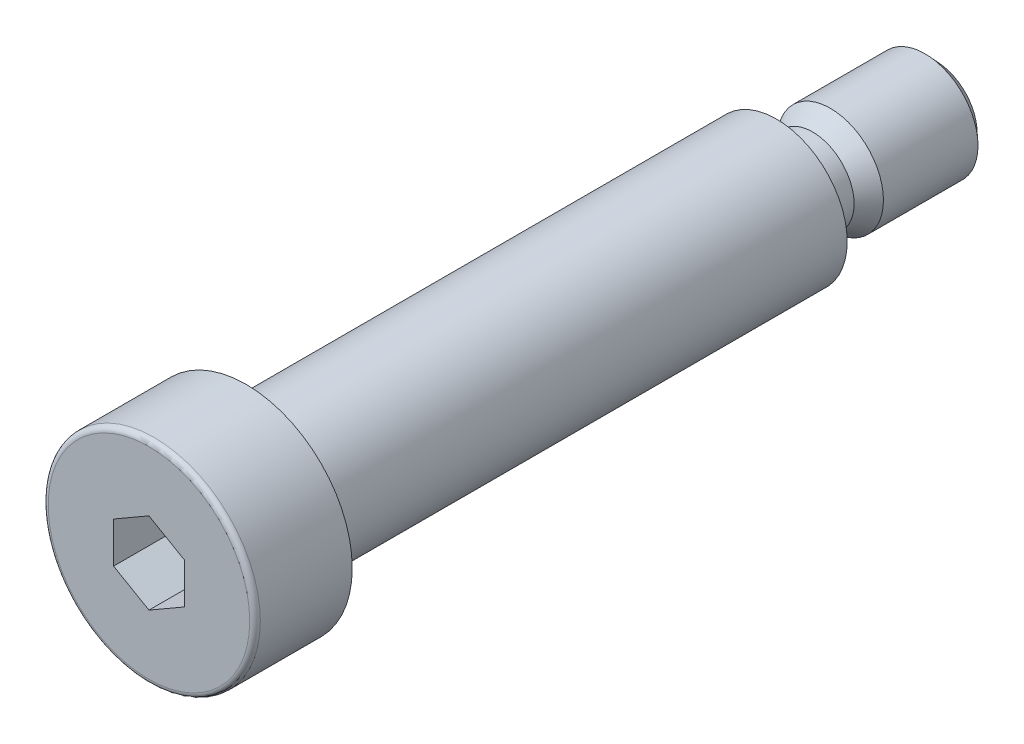
ISO-10303-21;
HEADER;
FILE_DESCRIPTION(('STEP AP214'),'2;1');
FILE_NAME('part.step','',(''),(''),'','','');
FILE_SCHEMA(('AUTOMOTIVE_DESIGN { 1 0 10303 214 1 1 1 1 }'));
ENDSEC;
DATA;
#1=APPLICATION_CONTEXT('core data for automotive mechanical design processes');
#2=APPLICATION_PROTOCOL_DEFINITION('international standard','automotive_design',2000,#1);
#3=PRODUCT_CONTEXT('',#1,'mechanical');
#4=PRODUCT('Part','Part','',(#3));
#5=PRODUCT_RELATED_PRODUCT_CATEGORY('part','',(#4));
#6=PRODUCT_DEFINITION_FORMATION('','',#4);
#7=PRODUCT_DEFINITION_CONTEXT('part definition',#1,'design');
#8=PRODUCT_DEFINITION('design','',#6,#7);
#9=PRODUCT_DEFINITION_SHAPE('','',#8);
#10=(LENGTH_UNIT() NAMED_UNIT(*) SI_UNIT(.MILLI.,.METRE.));
#11=(NAMED_UNIT(*) PLANE_ANGLE_UNIT() SI_UNIT($,.RADIAN.));
#12=(NAMED_UNIT(*) SI_UNIT($,.STERADIAN.) SOLID_ANGLE_UNIT());
#13=UNCERTAINTY_MEASURE_WITH_UNIT(LENGTH_MEASURE(1.E-05),#10,'distance_accuracy_value','');
#14=(GEOMETRIC_REPRESENTATION_CONTEXT(3) GLOBAL_UNCERTAINTY_ASSIGNED_CONTEXT((#13)) GLOBAL_UNIT_ASSIGNED_CONTEXT((#10,
#11,#12)) REPRESENTATION_CONTEXT('',''));
#15=CARTESIAN_POINT('',(0.,0.,0.));
#16=DIRECTION('',(0.,0.,1.));
#17=DIRECTION('',(1.,0.,0.));
#18=AXIS2_PLACEMENT_3D('',#15,#16,#17);
#19=CARTESIAN_POINT('',(0.,0.,41.));
#20=DIRECTION('',(0.,0.,1.));
#21=DIRECTION('',(1.,0.,0.));
#22=AXIS2_PLACEMENT_3D('',#19,#20,#21);
#23=PLANE('',#22);
#24=CARTESIAN_POINT('',(0.,0.,41.));
#25=DIRECTION('',(0.,0.,1.));
#26=DIRECTION('',(1.,0.,0.));
#27=AXIS2_PLACEMENT_3D('',#24,#25,#26);
#28=CIRCLE('',#27,11.4);
#29=CARTESIAN_POINT('',(11.4,0.,41.));
#30=VERTEX_POINT('',#29);
#31=EDGE_CURVE('E42',#30,#30,#28,.T.);
#32=ORIENTED_EDGE('',*,*,#31,.T.);
#33=EDGE_LOOP('',(#32));
#34=FACE_BOUND('',#33,.T.);
#35=DIRECTION('',(0.,1.,0.));
#36=VECTOR('',#35,1.);
#37=CARTESIAN_POINT('',(4.,-2.30940107675851,41.));
#38=LINE('',#37,#36);
#39=CARTESIAN_POINT('',(4.,-2.30940107675851,41.));
#40=VERTEX_POINT('',#39);
#41=CARTESIAN_POINT('',(4.,2.3094010767585,41.));
#42=VERTEX_POINT('',#41);
#43=EDGE_CURVE('E49',#40,#42,#38,.T.);
#44=ORIENTED_EDGE('',*,*,#43,.F.);
#45=DIRECTION('',(0.866025403784439,0.5,0.));
#46=VECTOR('',#45,1.);
#47=CARTESIAN_POINT('',(0.,-4.61880215351701,41.));
#48=LINE('',#47,#46);
#49=CARTESIAN_POINT('',(0.,-4.61880215351701,41.));
#50=VERTEX_POINT('',#49);
#51=EDGE_CURVE('E132',#50,#40,#48,.T.);
#52=ORIENTED_EDGE('',*,*,#51,.F.);
#53=DIRECTION('',(0.866025403784439,-0.5,0.));
#54=VECTOR('',#53,1.);
#55=CARTESIAN_POINT('',(-4.,-2.3094010767585,41.));
#56=LINE('',#55,#54);
#57=CARTESIAN_POINT('',(-4.,-2.3094010767585,41.));
#58=VERTEX_POINT('',#57);
#59=EDGE_CURVE('E130',#58,#50,#56,.T.);
#60=ORIENTED_EDGE('',*,*,#59,.F.);
#61=DIRECTION('',(0.,-1.,0.));
#62=VECTOR('',#61,1.);
#63=CARTESIAN_POINT('',(-4.,2.30940107675851,41.));
#64=LINE('',#63,#62);
#65=CARTESIAN_POINT('',(-4.,2.30940107675851,41.));
#66=VERTEX_POINT('',#65);
#67=EDGE_CURVE('E97',#66,#58,#64,.T.);
#68=ORIENTED_EDGE('',*,*,#67,.F.);
#69=DIRECTION('',(-0.866025403784439,-0.5,0.));
#70=VECTOR('',#69,1.);
#71=CARTESIAN_POINT('',(0.,4.61880215351701,41.));
#72=LINE('',#71,#70);
#73=CARTESIAN_POINT('',(0.,4.61880215351701,41.));
#74=VERTEX_POINT('',#73);
#75=EDGE_CURVE('E126',#74,#66,#72,.T.);
#76=ORIENTED_EDGE('',*,*,#75,.F.);
#77=DIRECTION('',(-0.866025403784439,0.5,0.));
#78=VECTOR('',#77,1.);
#79=CARTESIAN_POINT('',(4.,2.3094010767585,41.));
#80=LINE('',#79,#78);
#81=EDGE_CURVE('E123',#42,#74,#80,.T.);
#82=ORIENTED_EDGE('',*,*,#81,.F.);
#83=EDGE_LOOP('',(#44,#52,#60,#68,#76,#82));
#84=FACE_BOUND('',#83,.T.);
#85=ADVANCED_FACE('F34',(#34,#84),#23,.T.);
#86=CARTESIAN_POINT('',(0.,0.,-48.));
#87=DIRECTION('',(0.,0.,1.));
#88=DIRECTION('',(1.,0.,0.));
#89=AXIS2_PLACEMENT_3D('',#86,#87,#88);
#90=PLANE('',#89);
#91=CARTESIAN_POINT('',(0.,0.,-48.));
#92=DIRECTION('',(0.,0.,1.));
#93=DIRECTION('',(1.,0.,0.));
#94=AXIS2_PLACEMENT_3D('',#91,#92,#93);
#95=CIRCLE('',#94,4.7);
#96=CARTESIAN_POINT('',(4.7,0.,-48.));
#97=VERTEX_POINT('',#96);
#98=EDGE_CURVE('E162',#97,#97,#95,.T.);
#99=ORIENTED_EDGE('',*,*,#98,.F.);
#100=EDGE_LOOP('',(#99));
#101=FACE_BOUND('',#100,.T.);
#102=ADVANCED_FACE('F178',(#101),#90,.F.);
#103=CARTESIAN_POINT('',(0.,0.,-48.));
#104=DIRECTION('',(0.,0.,1.));
#105=DIRECTION('',(1.,0.,0.));
#106=AXIS2_PLACEMENT_3D('',#103,#104,#105);
#107=CONICAL_SURFACE('',#106,4.7,0.825376850520736);
#108=CARTESIAN_POINT('',(0.,0.,-46.8));
#109=DIRECTION('',(0.,0.,1.));
#110=DIRECTION('',(1.,0.,0.));
#111=AXIS2_PLACEMENT_3D('',#108,#109,#110);
#112=CIRCLE('',#111,6.);
#113=CARTESIAN_POINT('',(6.,0.,-46.8));
#114=VERTEX_POINT('',#113);
#115=EDGE_CURVE('E159',#114,#114,#112,.T.);
#116=ORIENTED_EDGE('',*,*,#115,.F.);
#117=EDGE_LOOP('',(#116));
#118=FACE_BOUND('',#117,.T.);
#119=ORIENTED_EDGE('',*,*,#98,.T.);
#120=EDGE_LOOP('',(#119));
#121=FACE_BOUND('',#120,.T.);
#122=ADVANCED_FACE('F182',(#118,#121),#107,.T.);
#123=CARTESIAN_POINT('',(0.,0.,41.));
#124=DIRECTION('',(0.,0.,1.));
#125=DIRECTION('',(1.,0.,0.));
#126=AXIS2_PLACEMENT_3D('',#123,#124,#125);
#127=CYLINDRICAL_SURFACE('',#126,6.);
#128=CARTESIAN_POINT('',(0.,0.,-36.1));
#129=DIRECTION('',(0.,0.,1.));
#130=DIRECTION('',(1.,0.,0.));
#131=AXIS2_PLACEMENT_3D('',#128,#129,#130);
#132=CIRCLE('',#131,6.);
#133=CARTESIAN_POINT('',(6.,0.,-36.1));
#134=VERTEX_POINT('',#133);
#135=EDGE_CURVE('E156',#134,#134,#132,.T.);
#136=ORIENTED_EDGE('',*,*,#135,.F.);
#137=EDGE_LOOP('',(#136));
#138=FACE_BOUND('',#137,.T.);
#139=ORIENTED_EDGE('',*,*,#115,.T.);
#140=EDGE_LOOP('',(#139));
#141=FACE_BOUND('',#140,.T.);
#142=ADVANCED_FACE('F188',(#138,#141),#127,.T.);
#143=CARTESIAN_POINT('',(0.,0.,-36.1));
#144=DIRECTION('',(0.,0.,-1.));
#145=DIRECTION('',(-1.,0.,0.));
#146=AXIS2_PLACEMENT_3D('',#143,#144,#145);
#147=CONICAL_SURFACE('',#146,6.,0.571837729916956);
#148=CARTESIAN_POINT('',(0.,0.,-34.08));
#149=DIRECTION('',(0.,0.,1.));
#150=DIRECTION('',(1.,0.,0.));
#151=AXIS2_PLACEMENT_3D('',#148,#149,#150);
#152=CIRCLE('',#151,4.70000000000001);
#153=CARTESIAN_POINT('',(4.70000000000001,0.,-34.08));
#154=VERTEX_POINT('',#153);
#155=EDGE_CURVE('E153',#154,#154,#152,.T.);
#156=ORIENTED_EDGE('',*,*,#155,.F.);
#157=EDGE_LOOP('',(#156));
#158=FACE_BOUND('',#157,.T.);
#159=ORIENTED_EDGE('',*,*,#135,.T.);
#160=EDGE_LOOP('',(#159));
#161=FACE_BOUND('',#160,.T.);
#162=ADVANCED_FACE('F192',(#158,#161),#147,.T.);
#163=CARTESIAN_POINT('',(0.,0.,41.));
#164=DIRECTION('',(0.,0.,1.));
#165=DIRECTION('',(1.,0.,0.));
#166=AXIS2_PLACEMENT_3D('',#163,#164,#165);
#167=CYLINDRICAL_SURFACE('',#166,4.70000000000001);
#168=ORIENTED_EDGE('',*,*,#155,.T.);
#169=EDGE_LOOP('',(#168));
#170=FACE_BOUND('',#169,.T.);
#171=CARTESIAN_POINT('',(0.,0.,-30.));
#172=DIRECTION('',(0.,0.,1.));
#173=DIRECTION('',(1.,0.,0.));
#174=AXIS2_PLACEMENT_3D('',#171,#172,#173);
#175=CIRCLE('',#174,4.70000000000001);
#176=CARTESIAN_POINT('',(4.70000000000001,0.,-30.));
#177=VERTEX_POINT('',#176);
#178=EDGE_CURVE('E150',#177,#177,#175,.T.);
#179=ORIENTED_EDGE('',*,*,#178,.F.);
#180=EDGE_LOOP('',(#179));
#181=FACE_BOUND('',#180,.T.);
#182=ADVANCED_FACE('F196',(#170,#181),#167,.T.);
#183=CARTESIAN_POINT('',(0.,0.,-30.));
#184=DIRECTION('',(0.,0.,1.));
#185=DIRECTION('',(1.,0.,0.));
#186=AXIS2_PLACEMENT_3D('',#183,#184,#185);
#187=PLANE('',#186);
#188=CARTESIAN_POINT('',(0.,0.,-30.));
#189=DIRECTION('',(0.,0.,1.));
#190=DIRECTION('',(1.,0.,0.));
#191=AXIS2_PLACEMENT_3D('',#188,#189,#190);
#192=CIRCLE('',#191,7.99999999999999);
#193=CARTESIAN_POINT('',(7.99999999999999,0.,-30.));
#194=VERTEX_POINT('',#193);
#195=EDGE_CURVE('E147',#194,#194,#192,.T.);
#196=ORIENTED_EDGE('',*,*,#195,.F.);
#197=EDGE_LOOP('',(#196));
#198=FACE_BOUND('',#197,.T.);
#199=ORIENTED_EDGE('',*,*,#178,.T.);
#200=EDGE_LOOP('',(#199));
#201=FACE_BOUND('',#200,.T.);
#202=ADVANCED_FACE('F200',(#198,#201),#187,.F.);
#203=CARTESIAN_POINT('',(0.,0.,41.));
#204=DIRECTION('',(0.,0.,1.));
#205=DIRECTION('',(1.,0.,0.));
#206=AXIS2_PLACEMENT_3D('',#203,#204,#205);
#207=CYLINDRICAL_SURFACE('',#206,7.99999999999999);
#208=ORIENTED_EDGE('',*,*,#195,.T.);
#209=EDGE_LOOP('',(#208));
#210=FACE_BOUND('',#209,.T.);
#211=CARTESIAN_POINT('',(0.,0.,30.));
#212=DIRECTION('',(0.,0.,1.));
#213=DIRECTION('',(1.,0.,0.));
#214=AXIS2_PLACEMENT_3D('',#211,#212,#213);
#215=CIRCLE('',#214,7.99999999999999);
#216=CARTESIAN_POINT('',(7.99999999999999,0.,30.));
#217=VERTEX_POINT('',#216);
#218=EDGE_CURVE('E144',#217,#217,#215,.T.);
#219=ORIENTED_EDGE('',*,*,#218,.F.);
#220=EDGE_LOOP('',(#219));
#221=FACE_BOUND('',#220,.T.);
#222=ADVANCED_FACE('F204',(#210,#221),#207,.T.);
#223=CARTESIAN_POINT('',(0.,0.,30.));
#224=DIRECTION('',(0.,0.,1.));
#225=DIRECTION('',(1.,0.,0.));
#226=AXIS2_PLACEMENT_3D('',#223,#224,#225);
#227=PLANE('',#226);
#228=CARTESIAN_POINT('',(0.,0.,30.));
#229=DIRECTION('',(0.,0.,1.));
#230=DIRECTION('',(1.,0.,0.));
#231=AXIS2_PLACEMENT_3D('',#228,#229,#230);
#232=CIRCLE('',#231,12.);
#233=CARTESIAN_POINT('',(12.,0.,30.));
#234=VERTEX_POINT('',#233);
#235=EDGE_CURVE('E136',#234,#234,#232,.T.);
#236=ORIENTED_EDGE('',*,*,#235,.F.);
#237=EDGE_LOOP('',(#236));
#238=FACE_BOUND('',#237,.T.);
#239=ORIENTED_EDGE('',*,*,#218,.T.);
#240=EDGE_LOOP('',(#239));
#241=FACE_BOUND('',#240,.T.);
#242=ADVANCED_FACE('F208',(#238,#241),#227,.F.);
#243=CARTESIAN_POINT('',(0.,0.,41.));
#244=DIRECTION('',(0.,0.,1.));
#245=DIRECTION('',(1.,0.,0.));
#246=AXIS2_PLACEMENT_3D('',#243,#244,#245);
#247=CYLINDRICAL_SURFACE('',#246,12.);
#248=CARTESIAN_POINT('',(0.,0.,40.4));
#249=DIRECTION('',(0.,0.,1.));
#250=DIRECTION('',(1.,0.,0.));
#251=AXIS2_PLACEMENT_3D('',#248,#249,#250);
#252=CIRCLE('',#251,12.);
#253=CARTESIAN_POINT('',(12.,0.,40.4));
#254=VERTEX_POINT('',#253);
#255=EDGE_CURVE('E11',#254,#254,#252,.F.);
#256=ORIENTED_EDGE('',*,*,#255,.T.);
#257=EDGE_LOOP('',(#256));
#258=FACE_BOUND('',#257,.T.);
#259=ORIENTED_EDGE('',*,*,#235,.T.);
#260=EDGE_LOOP('',(#259));
#261=FACE_BOUND('',#260,.T.);
#262=ADVANCED_FACE('F212',(#258,#261),#247,.T.);
#263=CARTESIAN_POINT('',(4.,-2.30940107675851,34.4));
#264=DIRECTION('',(1.,0.,0.));
#265=DIRECTION('',(0.,0.,-1.));
#266=AXIS2_PLACEMENT_3D('',#263,#264,#265);
#267=PLANE('',#266);
#268=ORIENTED_EDGE('',*,*,#43,.T.);
#269=DIRECTION('',(0.,0.,1.));
#270=VECTOR('',#269,1.);
#271=CARTESIAN_POINT('',(4.,2.3094010767585,34.4));
#272=LINE('',#271,#270);
#273=CARTESIAN_POINT('',(4.,2.3094010767585,34.4));
#274=VERTEX_POINT('',#273);
#275=EDGE_CURVE('E79',#274,#42,#272,.T.);
#276=ORIENTED_EDGE('',*,*,#275,.F.);
#277=DIRECTION('',(0.,1.,0.));
#278=VECTOR('',#277,1.);
#279=CARTESIAN_POINT('',(4.,-2.30940107675851,34.4));
#280=LINE('',#279,#278);
#281=CARTESIAN_POINT('',(4.,-2.30940107675851,34.4));
#282=VERTEX_POINT('',#281);
#283=EDGE_CURVE('E134',#282,#274,#280,.T.);
#284=ORIENTED_EDGE('',*,*,#283,.F.);
#285=DIRECTION('',(0.,0.,1.));
#286=VECTOR('',#285,1.);
#287=CARTESIAN_POINT('',(4.,-2.30940107675851,34.4));
#288=LINE('',#287,#286);
#289=EDGE_CURVE('E57',#282,#40,#288,.T.);
#290=ORIENTED_EDGE('',*,*,#289,.T.);
#291=EDGE_LOOP('',(#268,#276,#284,#290));
#292=FACE_BOUND('',#291,.T.);
#293=ADVANCED_FACE('F216',(#292),#267,.F.);
#294=CARTESIAN_POINT('',(0.,-4.61880215351701,34.4));
#295=DIRECTION('',(0.5,-0.866025403784439,0.));
#296=DIRECTION('',(0.866025403784439,0.5,0.));
#297=AXIS2_PLACEMENT_3D('',#294,#295,#296);
#298=PLANE('',#297);
#299=ORIENTED_EDGE('',*,*,#51,.T.);
#300=ORIENTED_EDGE('',*,*,#289,.F.);
#301=DIRECTION('',(0.866025403784439,0.5,0.));
#302=VECTOR('',#301,1.);
#303=CARTESIAN_POINT('',(0.,-4.61880215351701,34.4));
#304=LINE('',#303,#302);
#305=CARTESIAN_POINT('',(0.,-4.61880215351701,34.4));
#306=VERTEX_POINT('',#305);
#307=EDGE_CURVE('E109',#306,#282,#304,.T.);
#308=ORIENTED_EDGE('',*,*,#307,.F.);
#309=DIRECTION('',(0.,0.,1.));
#310=VECTOR('',#309,1.);
#311=CARTESIAN_POINT('',(0.,-4.61880215351701,34.4));
#312=LINE('',#311,#310);
#313=EDGE_CURVE('E101',#306,#50,#312,.T.);
#314=ORIENTED_EDGE('',*,*,#313,.T.);
#315=EDGE_LOOP('',(#299,#300,#308,#314));
#316=FACE_BOUND('',#315,.T.);
#317=ADVANCED_FACE('F220',(#316),#298,.F.);
#318=CARTESIAN_POINT('',(-4.,-2.3094010767585,34.4));
#319=DIRECTION('',(-0.5,-0.866025403784439,0.));
#320=DIRECTION('',(0.866025403784439,-0.5,0.));
#321=AXIS2_PLACEMENT_3D('',#318,#319,#320);
#322=PLANE('',#321);
#323=ORIENTED_EDGE('',*,*,#59,.T.);
#324=ORIENTED_EDGE('',*,*,#313,.F.);
#325=DIRECTION('',(0.866025403784439,-0.5,0.));
#326=VECTOR('',#325,1.);
#327=CARTESIAN_POINT('',(-4.,-2.3094010767585,34.4));
#328=LINE('',#327,#326);
#329=CARTESIAN_POINT('',(-4.,-2.3094010767585,34.4));
#330=VERTEX_POINT('',#329);
#331=EDGE_CURVE('E105',#330,#306,#328,.T.);
#332=ORIENTED_EDGE('',*,*,#331,.F.);
#333=DIRECTION('',(0.,0.,1.));
#334=VECTOR('',#333,1.);
#335=CARTESIAN_POINT('',(-4.,-2.3094010767585,34.4));
#336=LINE('',#335,#334);
#337=EDGE_CURVE('E90',#330,#58,#336,.T.);
#338=ORIENTED_EDGE('',*,*,#337,.T.);
#339=EDGE_LOOP('',(#323,#324,#332,#338));
#340=FACE_BOUND('',#339,.T.);
#341=ADVANCED_FACE('F106',(#340),#322,.F.);
#342=CARTESIAN_POINT('',(-4.,2.30940107675851,34.4));
#343=DIRECTION('',(-1.,0.,0.));
#344=DIRECTION('',(0.,-1.,0.));
#345=AXIS2_PLACEMENT_3D('',#342,#343,#344);
#346=PLANE('',#345);
#347=ORIENTED_EDGE('',*,*,#67,.T.);
#348=ORIENTED_EDGE('',*,*,#337,.F.);
#349=DIRECTION('',(0.,-1.,0.));
#350=VECTOR('',#349,1.);
#351=CARTESIAN_POINT('',(-4.,2.30940107675851,34.4));
#352=LINE('',#351,#350);
#353=CARTESIAN_POINT('',(-4.,2.30940107675851,34.4));
#354=VERTEX_POINT('',#353);
#355=EDGE_CURVE('E94',#354,#330,#352,.T.);
#356=ORIENTED_EDGE('',*,*,#355,.F.);
#357=DIRECTION('',(0.,0.,1.));
#358=VECTOR('',#357,1.);
#359=CARTESIAN_POINT('',(-4.,2.30940107675851,34.4));
#360=LINE('',#359,#358);
#361=EDGE_CURVE('E102',#354,#66,#360,.T.);
#362=ORIENTED_EDGE('',*,*,#361,.T.);
#363=EDGE_LOOP('',(#347,#348,#356,#362));
#364=FACE_BOUND('',#363,.T.);
#365=ADVANCED_FACE('F92',(#364),#346,.F.);
#366=CARTESIAN_POINT('',(0.,4.61880215351701,34.4));
#367=DIRECTION('',(-0.5,0.866025403784439,0.));
#368=DIRECTION('',(-0.866025403784439,-0.5,0.));
#369=AXIS2_PLACEMENT_3D('',#366,#367,#368);
#370=PLANE('',#369);
#371=ORIENTED_EDGE('',*,*,#75,.T.);
#372=ORIENTED_EDGE('',*,*,#361,.F.);
#373=DIRECTION('',(-0.866025403784439,-0.5,0.));
#374=VECTOR('',#373,1.);
#375=CARTESIAN_POINT('',(0.,4.61880215351701,34.4));
#376=LINE('',#375,#374);
#377=CARTESIAN_POINT('',(0.,4.61880215351701,34.4));
#378=VERTEX_POINT('',#377);
#379=EDGE_CURVE('E115',#378,#354,#376,.T.);
#380=ORIENTED_EDGE('',*,*,#379,.F.);
#381=DIRECTION('',(0.,0.,1.));
#382=VECTOR('',#381,1.);
#383=CARTESIAN_POINT('',(0.,4.61880215351701,34.4));
#384=LINE('',#383,#382);
#385=EDGE_CURVE('E139',#378,#74,#384,.T.);
#386=ORIENTED_EDGE('',*,*,#385,.T.);
#387=EDGE_LOOP('',(#371,#372,#380,#386));
#388=FACE_BOUND('',#387,.T.);
#389=ADVANCED_FACE('F223',(#388),#370,.F.);
#390=CARTESIAN_POINT('',(4.,2.3094010767585,34.4));
#391=DIRECTION('',(0.5,0.866025403784439,0.));
#392=DIRECTION('',(-0.866025403784439,0.5,0.));
#393=AXIS2_PLACEMENT_3D('',#390,#391,#392);
#394=PLANE('',#393);
#395=ORIENTED_EDGE('',*,*,#81,.T.);
#396=ORIENTED_EDGE('',*,*,#385,.F.);
#397=DIRECTION('',(-0.866025403784439,0.5,0.));
#398=VECTOR('',#397,1.);
#399=CARTESIAN_POINT('',(4.,2.3094010767585,34.4));
#400=LINE('',#399,#398);
#401=EDGE_CURVE('E117',#274,#378,#400,.T.);
#402=ORIENTED_EDGE('',*,*,#401,.F.);
#403=ORIENTED_EDGE('',*,*,#275,.T.);
#404=EDGE_LOOP('',(#395,#396,#402,#403));
#405=FACE_BOUND('',#404,.T.);
#406=ADVANCED_FACE('F174',(#405),#394,.F.);
#407=CARTESIAN_POINT('',(0.,0.,34.4));
#408=DIRECTION('',(0.,0.,1.));
#409=DIRECTION('',(1.,0.,0.));
#410=AXIS2_PLACEMENT_3D('',#407,#408,#409);
#411=PLANE('',#410);
#412=ORIENTED_EDGE('',*,*,#283,.T.);
#413=ORIENTED_EDGE('',*,*,#401,.T.);
#414=ORIENTED_EDGE('',*,*,#379,.T.);
#415=ORIENTED_EDGE('',*,*,#355,.T.);
#416=ORIENTED_EDGE('',*,*,#331,.T.);
#417=ORIENTED_EDGE('',*,*,#307,.T.);
#418=EDGE_LOOP('',(#412,#413,#414,#415,#416,#417));
#419=FACE_BOUND('',#418,.T.);
#420=ADVANCED_FACE('F112',(#419),#411,.T.);
#421=CARTESIAN_POINT('',(0.,0.,40.4));
#422=DIRECTION('',(0.,0.,1.));
#423=DIRECTION('',(1.,0.,0.));
#424=AXIS2_PLACEMENT_3D('',#421,#422,#423);
#425=TOROIDAL_SURFACE('',#424,11.4,0.6);
#426=ORIENTED_EDGE('',*,*,#255,.F.);
#427=EDGE_LOOP('',(#426));
#428=FACE_BOUND('',#427,.T.);
#429=ORIENTED_EDGE('',*,*,#31,.F.);
#430=EDGE_LOOP('',(#429));
#431=FACE_BOUND('',#430,.T.);
#432=ADVANCED_FACE('F36',(#428,#431),#425,.T.);
#433=CLOSED_SHELL('',(#85,#102,#122,#142,#162,#182,#202,#222,#242,#262,#293,#317,#341,#365,#389,
#406,#420,#432));
#434=MANIFOLD_SOLID_BREP('B2',#433);
#435=ADVANCED_BREP_SHAPE_REPRESENTATION('',(#18,#434),#14);
#436=SHAPE_DEFINITION_REPRESENTATION(#9,#435);
ENDSEC;
END-ISO-10303-21;
